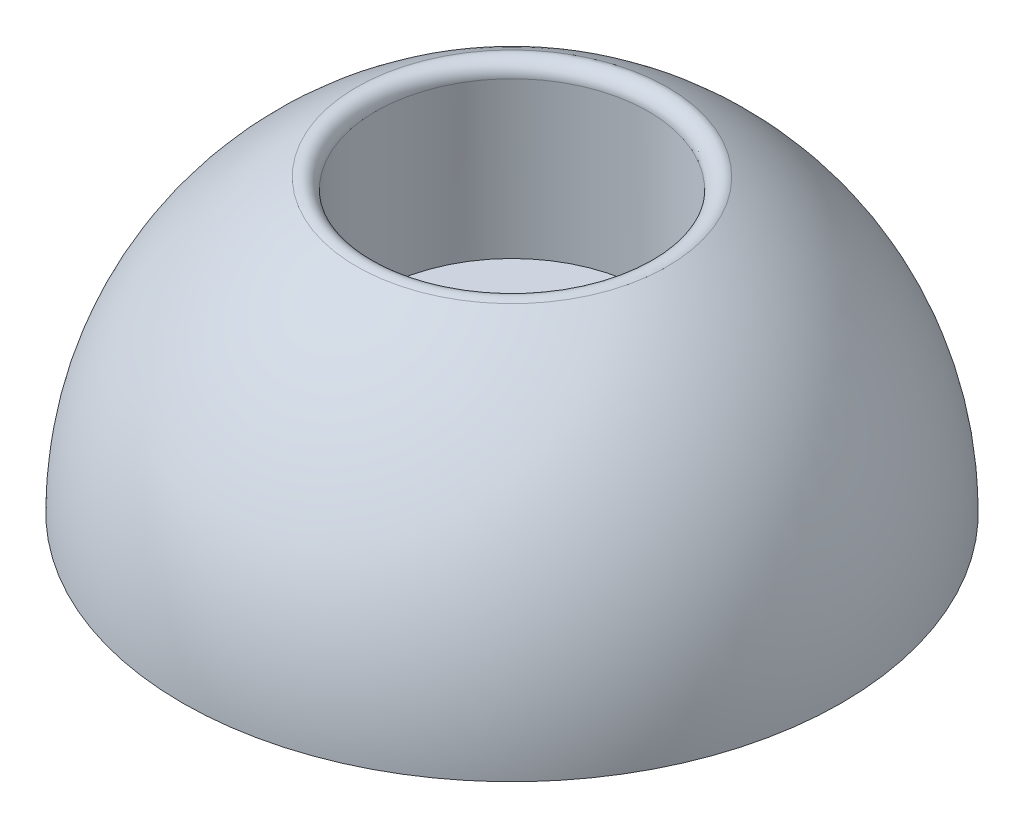
ISO-10303-21;
HEADER;
FILE_DESCRIPTION(('STEP AP214'),'2;1');
FILE_NAME('part.step','',(''),(''),'','','');
FILE_SCHEMA(('AUTOMOTIVE_DESIGN { 1 0 10303 214 1 1 1 1 }'));
ENDSEC;
DATA;
#1=APPLICATION_CONTEXT('core data for automotive mechanical design processes');
#2=APPLICATION_PROTOCOL_DEFINITION('international standard','automotive_design',2000,#1);
#3=PRODUCT_CONTEXT('',#1,'mechanical');
#4=PRODUCT('Part','Part','',(#3));
#5=PRODUCT_RELATED_PRODUCT_CATEGORY('part','',(#4));
#6=PRODUCT_DEFINITION_FORMATION('','',#4);
#7=PRODUCT_DEFINITION_CONTEXT('part definition',#1,'design');
#8=PRODUCT_DEFINITION('design','',#6,#7);
#9=PRODUCT_DEFINITION_SHAPE('','',#8);
#10=(LENGTH_UNIT() NAMED_UNIT(*) SI_UNIT(.MILLI.,.METRE.));
#11=(NAMED_UNIT(*) PLANE_ANGLE_UNIT() SI_UNIT($,.RADIAN.));
#12=(NAMED_UNIT(*) SI_UNIT($,.STERADIAN.) SOLID_ANGLE_UNIT());
#13=UNCERTAINTY_MEASURE_WITH_UNIT(LENGTH_MEASURE(1.E-05),#10,'distance_accuracy_value','');
#14=(GEOMETRIC_REPRESENTATION_CONTEXT(3) GLOBAL_UNCERTAINTY_ASSIGNED_CONTEXT((#13)) GLOBAL_UNIT_ASSIGNED_CONTEXT((#10,
#11,#12)) REPRESENTATION_CONTEXT('',''));
#15=CARTESIAN_POINT('',(0.,0.,0.));
#16=DIRECTION('',(0.,0.,1.));
#17=DIRECTION('',(1.,0.,0.));
#18=AXIS2_PLACEMENT_3D('',#15,#16,#17);
#19=CARTESIAN_POINT('',(0.,0.,0.));
#20=DIRECTION('',(0.,-1.,0.));
#21=DIRECTION('',(0.,0.,-1.));
#22=AXIS2_PLACEMENT_3D('',#19,#20,#21);
#23=CYLINDRICAL_SURFACE('',#22,3.29999999999999);
#24=CARTESIAN_POINT('',(0.,0.,0.));
#25=DIRECTION('',(0.,-1.,0.));
#26=DIRECTION('',(0.,0.,-1.));
#27=AXIS2_PLACEMENT_3D('',#24,#25,#26);
#28=CIRCLE('',#27,3.29999999999999);
#29=CARTESIAN_POINT('',(0.,0.,-3.29999999999999));
#30=VERTEX_POINT('',#29);
#31=EDGE_CURVE('E63',#30,#30,#28,.T.);
#32=ORIENTED_EDGE('',*,*,#31,.T.);
#33=EDGE_LOOP('',(#32));
#34=FACE_BOUND('',#33,.T.);
#35=CARTESIAN_POINT('',(0.,4.76376777340471,0.));
#36=DIRECTION('',(0.,1.,0.));
#37=DIRECTION('',(0.,0.,1.));
#38=AXIS2_PLACEMENT_3D('',#35,#36,#37);
#39=CIRCLE('',#38,3.29999999999999);
#40=CARTESIAN_POINT('',(0.,4.76376777340471,3.29999999999999));
#41=VERTEX_POINT('',#40);
#42=EDGE_CURVE('E66',#41,#41,#39,.F.);
#43=ORIENTED_EDGE('',*,*,#42,.F.);
#44=EDGE_LOOP('',(#43));
#45=FACE_BOUND('',#44,.T.);
#46=ADVANCED_FACE('F45',(#34,#45),#23,.F.);
#47=CARTESIAN_POINT('',(0.,0.,0.));
#48=DIRECTION('',(0.,-1.,0.));
#49=DIRECTION('',(0.,0.,-1.));
#50=AXIS2_PLACEMENT_3D('',#47,#48,#49);
#51=PLANE('',#50);
#52=ORIENTED_EDGE('',*,*,#31,.F.);
#53=EDGE_LOOP('',(#52));
#54=FACE_BOUND('',#53,.T.);
#55=CARTESIAN_POINT('',(0.,0.,0.));
#56=DIRECTION('',(0.,-1.,0.));
#57=DIRECTION('',(0.,0.,-1.));
#58=AXIS2_PLACEMENT_3D('',#55,#56,#57);
#59=CIRCLE('',#58,12.7);
#60=CARTESIAN_POINT('',(0.,0.,-12.7));
#61=VERTEX_POINT('',#60);
#62=EDGE_CURVE('E58',#61,#61,#59,.T.);
#63=ORIENTED_EDGE('',*,*,#62,.T.);
#64=EDGE_LOOP('',(#63));
#65=FACE_BOUND('',#64,.T.);
#66=ADVANCED_FACE('F94',(#54,#65),#51,.T.);
#67=CARTESIAN_POINT('',(0.,0.,0.));
#68=DIRECTION('',(0.,-1.,0.));
#69=DIRECTION('',(1.,0.,0.));
#70=AXIS2_PLACEMENT_3D('',#67,#68,#69);
#71=SPHERICAL_SURFACE('',#70,12.7);
#72=CARTESIAN_POINT('',(0.,11.2009787692719,0.));
#73=DIRECTION('',(0.,-1.,0.));
#74=DIRECTION('',(0.,0.,-1.));
#75=AXIS2_PLACEMENT_3D('',#72,#73,#74);
#76=CIRCLE('',#75,5.98565573770492);
#77=CARTESIAN_POINT('',(0.,11.2009787692719,-5.98565573770492));
#78=VERTEX_POINT('',#77);
#79=EDGE_CURVE('E10',#78,#78,#76,.T.);
#80=ORIENTED_EDGE('',*,*,#79,.T.);
#81=EDGE_LOOP('',(#80));
#82=FACE_BOUND('',#81,.T.);
#83=ORIENTED_EDGE('',*,*,#62,.F.);
#84=EDGE_LOOP('',(#83));
#85=FACE_BOUND('',#84,.T.);
#86=ADVANCED_FACE('F90',(#82,#85),#71,.T.);
#87=CARTESIAN_POINT('',(0.,4.76376777340471,0.));
#88=DIRECTION('',(0.,1.,0.));
#89=DIRECTION('',(0.,0.,1.));
#90=AXIS2_PLACEMENT_3D('',#87,#88,#89);
#91=PLANE('',#90);
#92=CARTESIAN_POINT('',(0.,4.76376777340471,0.));
#93=DIRECTION('',(0.,1.,0.));
#94=DIRECTION('',(0.,0.,1.));
#95=AXIS2_PLACEMENT_3D('',#92,#93,#94);
#96=CIRCLE('',#95,5.25);
#97=CARTESIAN_POINT('',(0.,4.76376777340471,5.25));
#98=VERTEX_POINT('',#97);
#99=EDGE_CURVE('E69',#98,#98,#96,.T.);
#100=ORIENTED_EDGE('',*,*,#99,.T.);
#101=EDGE_LOOP('',(#100));
#102=FACE_BOUND('',#101,.T.);
#103=ORIENTED_EDGE('',*,*,#42,.T.);
#104=EDGE_LOOP('',(#103));
#105=FACE_BOUND('',#104,.T.);
#106=ADVANCED_FACE('F78',(#102,#105),#91,.T.);
#107=CARTESIAN_POINT('',(0.,4.76376777340471,0.));
#108=DIRECTION('',(0.,1.,0.));
#109=DIRECTION('',(0.,0.,1.));
#110=AXIS2_PLACEMENT_3D('',#107,#108,#109);
#111=CYLINDRICAL_SURFACE('',#110,5.25);
#112=CARTESIAN_POINT('',(0.,10.7599953531588,0.));
#113=DIRECTION('',(0.,-1.,0.));
#114=DIRECTION('',(0.,0.,-1.));
#115=AXIS2_PLACEMENT_3D('',#112,#113,#114);
#116=CIRCLE('',#115,5.25);
#117=CARTESIAN_POINT('',(0.,10.7599953531588,-5.25));
#118=VERTEX_POINT('',#117);
#119=EDGE_CURVE('E53',#118,#118,#116,.F.);
#120=ORIENTED_EDGE('',*,*,#119,.T.);
#121=EDGE_LOOP('',(#120));
#122=FACE_BOUND('',#121,.T.);
#123=ORIENTED_EDGE('',*,*,#99,.F.);
#124=EDGE_LOOP('',(#123));
#125=FACE_BOUND('',#124,.T.);
#126=ADVANCED_FACE('F81',(#122,#125),#111,.F.);
#127=CARTESIAN_POINT('',(0.,10.7599953531588,0.));
#128=DIRECTION('',(0.,-1.,0.));
#129=DIRECTION('',(0.,0.,-1.));
#130=AXIS2_PLACEMENT_3D('',#127,#128,#129);
#131=TOROIDAL_SURFACE('',#130,5.75,0.5);
#132=ORIENTED_EDGE('',*,*,#79,.F.);
#133=EDGE_LOOP('',(#132));
#134=FACE_BOUND('',#133,.T.);
#135=ORIENTED_EDGE('',*,*,#119,.F.);
#136=EDGE_LOOP('',(#135));
#137=FACE_BOUND('',#136,.T.);
#138=ADVANCED_FACE('F47',(#134,#137),#131,.T.);
#139=CLOSED_SHELL('',(#46,#66,#86,#106,#126,#138));
#140=MANIFOLD_SOLID_BREP('B2',#139);
#141=ADVANCED_BREP_SHAPE_REPRESENTATION('',(#18,#140),#14);
#142=SHAPE_DEFINITION_REPRESENTATION(#9,#141);
ENDSEC;
END-ISO-10303-21;
